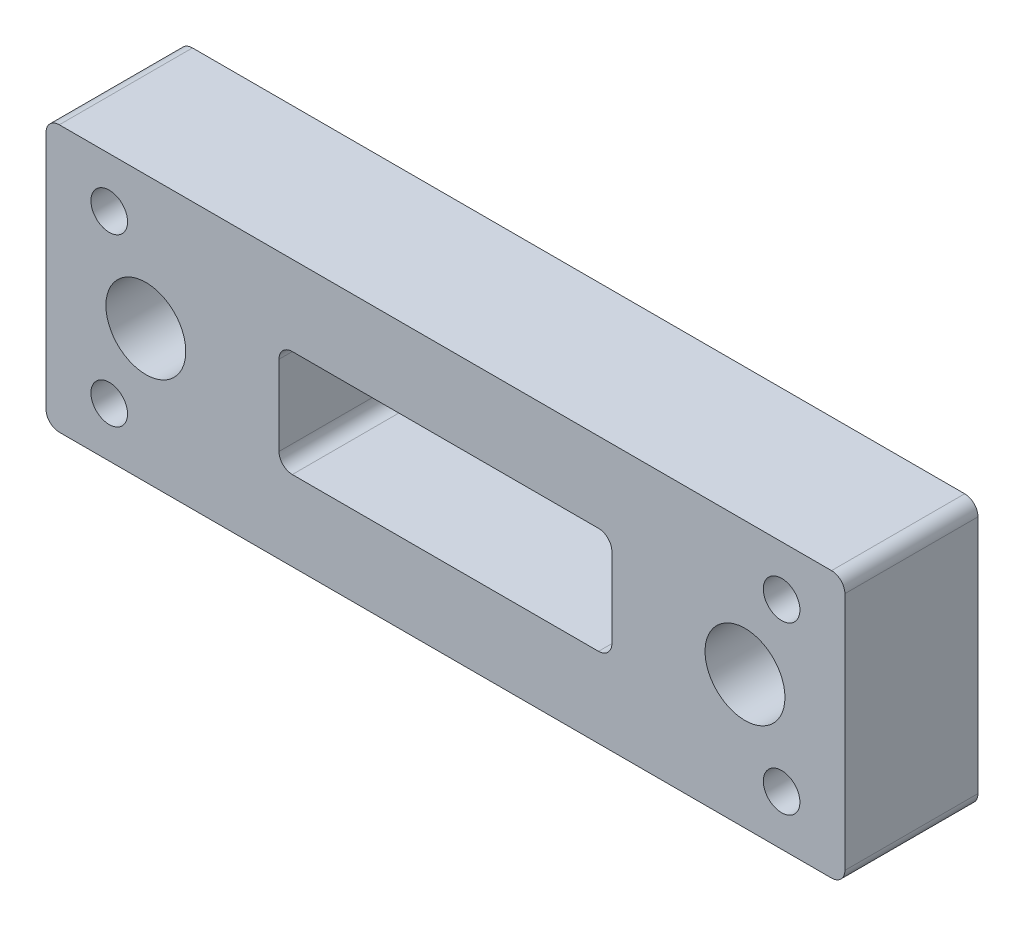
ISO-10303-21;
HEADER;
FILE_DESCRIPTION(('STEP AP214'),'2;1');
FILE_NAME('part.step','',(''),(''),'','','');
FILE_SCHEMA(('AUTOMOTIVE_DESIGN { 1 0 10303 214 1 1 1 1 }'));
ENDSEC;
DATA;
#1=APPLICATION_CONTEXT('core data for automotive mechanical design processes');
#2=APPLICATION_PROTOCOL_DEFINITION('international standard','automotive_design',2000,#1);
#3=PRODUCT_CONTEXT('',#1,'mechanical');
#4=PRODUCT('Part','Part','',(#3));
#5=PRODUCT_RELATED_PRODUCT_CATEGORY('part','',(#4));
#6=PRODUCT_DEFINITION_FORMATION('','',#4);
#7=PRODUCT_DEFINITION_CONTEXT('part definition',#1,'design');
#8=PRODUCT_DEFINITION('design','',#6,#7);
#9=PRODUCT_DEFINITION_SHAPE('','',#8);
#10=(LENGTH_UNIT() NAMED_UNIT(*) SI_UNIT(.MILLI.,.METRE.));
#11=(NAMED_UNIT(*) PLANE_ANGLE_UNIT() SI_UNIT($,.RADIAN.));
#12=(NAMED_UNIT(*) SI_UNIT($,.STERADIAN.) SOLID_ANGLE_UNIT());
#13=UNCERTAINTY_MEASURE_WITH_UNIT(LENGTH_MEASURE(1.E-05),#10,'distance_accuracy_value','');
#14=(GEOMETRIC_REPRESENTATION_CONTEXT(3) GLOBAL_UNCERTAINTY_ASSIGNED_CONTEXT((#13)) GLOBAL_UNIT_ASSIGNED_CONTEXT((#10,
#11,#12)) REPRESENTATION_CONTEXT('',''));
#15=CARTESIAN_POINT('',(0.,0.,0.));
#16=DIRECTION('',(0.,0.,1.));
#17=DIRECTION('',(1.,0.,0.));
#18=AXIS2_PLACEMENT_3D('',#15,#16,#17);
#19=CARTESIAN_POINT('',(-60.,20.,20.));
#20=DIRECTION('',(1.,0.,0.));
#21=DIRECTION('',(0.,1.,0.));
#22=AXIS2_PLACEMENT_3D('',#19,#20,#21);
#23=PLANE('',#22);
#24=DIRECTION('',(0.,-1.,0.));
#25=VECTOR('',#24,1.);
#26=CARTESIAN_POINT('',(-60.,20.,20.));
#27=LINE('',#26,#25);
#28=CARTESIAN_POINT('',(-60.,18.,20.));
#29=VERTEX_POINT('',#28);
#30=CARTESIAN_POINT('',(-60.,-18.,20.));
#31=VERTEX_POINT('',#30);
#32=EDGE_CURVE('E167',#29,#31,#27,.T.);
#33=ORIENTED_EDGE('',*,*,#32,.F.);
#34=DIRECTION('',(0.,0.,-1.));
#35=VECTOR('',#34,1.);
#36=CARTESIAN_POINT('',(-60.,18.,20.));
#37=LINE('',#36,#35);
#38=CARTESIAN_POINT('',(-60.,18.,0.));
#39=VERTEX_POINT('',#38);
#40=EDGE_CURVE('E152',#29,#39,#37,.T.);
#41=ORIENTED_EDGE('',*,*,#40,.T.);
#42=DIRECTION('',(0.,-1.,0.));
#43=VECTOR('',#42,1.);
#44=CARTESIAN_POINT('',(-60.,20.,0.));
#45=LINE('',#44,#43);
#46=CARTESIAN_POINT('',(-60.,-18.,0.));
#47=VERTEX_POINT('',#46);
#48=EDGE_CURVE('E164',#39,#47,#45,.T.);
#49=ORIENTED_EDGE('',*,*,#48,.T.);
#50=DIRECTION('',(0.,0.,-1.));
#51=VECTOR('',#50,1.);
#52=CARTESIAN_POINT('',(-60.,-18.,20.));
#53=LINE('',#52,#51);
#54=EDGE_CURVE('E169',#47,#31,#53,.F.);
#55=ORIENTED_EDGE('',*,*,#54,.T.);
#56=EDGE_LOOP('',(#33,#41,#49,#55));
#57=FACE_BOUND('',#56,.T.);
#58=ADVANCED_FACE('F35',(#57),#23,.F.);
#59=CARTESIAN_POINT('',(-60.,-20.,20.));
#60=DIRECTION('',(0.,1.,0.));
#61=DIRECTION('',(-1.,0.,0.));
#62=AXIS2_PLACEMENT_3D('',#59,#60,#61);
#63=PLANE('',#62);
#64=DIRECTION('',(1.,0.,0.));
#65=VECTOR('',#64,1.);
#66=CARTESIAN_POINT('',(-60.,-20.,20.));
#67=LINE('',#66,#65);
#68=CARTESIAN_POINT('',(-58.,-20.,20.));
#69=VERTEX_POINT('',#68);
#70=CARTESIAN_POINT('',(58.,-20.,20.));
#71=VERTEX_POINT('',#70);
#72=EDGE_CURVE('E313',#69,#71,#67,.T.);
#73=ORIENTED_EDGE('',*,*,#72,.F.);
#74=DIRECTION('',(0.,0.,-1.));
#75=VECTOR('',#74,1.);
#76=CARTESIAN_POINT('',(-58.,-20.,20.));
#77=LINE('',#76,#75);
#78=CARTESIAN_POINT('',(-58.,-20.,0.));
#79=VERTEX_POINT('',#78);
#80=EDGE_CURVE('E208',#69,#79,#77,.T.);
#81=ORIENTED_EDGE('',*,*,#80,.T.);
#82=DIRECTION('',(1.,0.,0.));
#83=VECTOR('',#82,1.);
#84=CARTESIAN_POINT('',(-60.,-20.,0.));
#85=LINE('',#84,#83);
#86=CARTESIAN_POINT('',(58.,-20.,0.));
#87=VERTEX_POINT('',#86);
#88=EDGE_CURVE('E173',#79,#87,#85,.T.);
#89=ORIENTED_EDGE('',*,*,#88,.T.);
#90=DIRECTION('',(0.,0.,-1.));
#91=VECTOR('',#90,1.);
#92=CARTESIAN_POINT('',(58.,-20.,20.));
#93=LINE('',#92,#91);
#94=EDGE_CURVE('E206',#87,#71,#93,.F.);
#95=ORIENTED_EDGE('',*,*,#94,.T.);
#96=EDGE_LOOP('',(#73,#81,#89,#95));
#97=FACE_BOUND('',#96,.T.);
#98=ADVANCED_FACE('F338',(#97),#63,.F.);
#99=CARTESIAN_POINT('',(60.,20.,20.));
#100=DIRECTION('',(-1.,0.,0.));
#101=DIRECTION('',(0.,-1.,0.));
#102=AXIS2_PLACEMENT_3D('',#99,#100,#101);
#103=PLANE('',#102);
#104=DIRECTION('',(0.,1.,0.));
#105=VECTOR('',#104,1.);
#106=CARTESIAN_POINT('',(60.,20.,0.));
#107=LINE('',#106,#105);
#108=CARTESIAN_POINT('',(60.,-18.,0.));
#109=VERTEX_POINT('',#108);
#110=CARTESIAN_POINT('',(60.,18.,0.));
#111=VERTEX_POINT('',#110);
#112=EDGE_CURVE('E177',#109,#111,#107,.T.);
#113=ORIENTED_EDGE('',*,*,#112,.T.);
#114=DIRECTION('',(0.,0.,-1.));
#115=VECTOR('',#114,1.);
#116=CARTESIAN_POINT('',(60.,18.,20.));
#117=LINE('',#116,#115);
#118=CARTESIAN_POINT('',(60.,18.,20.));
#119=VERTEX_POINT('',#118);
#120=EDGE_CURVE('E214',#111,#119,#117,.F.);
#121=ORIENTED_EDGE('',*,*,#120,.T.);
#122=DIRECTION('',(0.,1.,0.));
#123=VECTOR('',#122,1.);
#124=CARTESIAN_POINT('',(60.,20.,20.));
#125=LINE('',#124,#123);
#126=CARTESIAN_POINT('',(60.,-18.,20.));
#127=VERTEX_POINT('',#126);
#128=EDGE_CURVE('E315',#127,#119,#125,.T.);
#129=ORIENTED_EDGE('',*,*,#128,.F.);
#130=DIRECTION('',(0.,0.,-1.));
#131=VECTOR('',#130,1.);
#132=CARTESIAN_POINT('',(60.,-18.,20.));
#133=LINE('',#132,#131);
#134=EDGE_CURVE('E211',#127,#109,#133,.T.);
#135=ORIENTED_EDGE('',*,*,#134,.T.);
#136=EDGE_LOOP('',(#113,#121,#129,#135));
#137=FACE_BOUND('',#136,.T.);
#138=ADVANCED_FACE('F330',(#137),#103,.F.);
#139=CARTESIAN_POINT('',(-60.,20.,20.));
#140=DIRECTION('',(0.,-1.,0.));
#141=DIRECTION('',(0.,0.,-1.));
#142=AXIS2_PLACEMENT_3D('',#139,#140,#141);
#143=PLANE('',#142);
#144=DIRECTION('',(-1.,0.,0.));
#145=VECTOR('',#144,1.);
#146=CARTESIAN_POINT('',(-60.,20.,0.));
#147=LINE('',#146,#145);
#148=CARTESIAN_POINT('',(58.,20.,0.));
#149=VERTEX_POINT('',#148);
#150=CARTESIAN_POINT('',(-58.,20.,0.));
#151=VERTEX_POINT('',#150);
#152=EDGE_CURVE('E188',#149,#151,#147,.T.);
#153=ORIENTED_EDGE('',*,*,#152,.T.);
#154=DIRECTION('',(0.,0.,-1.));
#155=VECTOR('',#154,1.);
#156=CARTESIAN_POINT('',(-58.,20.,20.));
#157=LINE('',#156,#155);
#158=CARTESIAN_POINT('',(-58.,20.,20.));
#159=VERTEX_POINT('',#158);
#160=EDGE_CURVE('E153',#151,#159,#157,.F.);
#161=ORIENTED_EDGE('',*,*,#160,.T.);
#162=DIRECTION('',(-1.,0.,0.));
#163=VECTOR('',#162,1.);
#164=CARTESIAN_POINT('',(-60.,20.,20.));
#165=LINE('',#164,#163);
#166=CARTESIAN_POINT('',(58.,20.,20.));
#167=VERTEX_POINT('',#166);
#168=EDGE_CURVE('E183',#167,#159,#165,.T.);
#169=ORIENTED_EDGE('',*,*,#168,.F.);
#170=DIRECTION('',(0.,0.,-1.));
#171=VECTOR('',#170,1.);
#172=CARTESIAN_POINT('',(58.,20.,20.));
#173=LINE('',#172,#171);
#174=EDGE_CURVE('E158',#167,#149,#173,.T.);
#175=ORIENTED_EDGE('',*,*,#174,.T.);
#176=EDGE_LOOP('',(#153,#161,#169,#175));
#177=FACE_BOUND('',#176,.T.);
#178=ADVANCED_FACE('F324',(#177),#143,.F.);
#179=CARTESIAN_POINT('',(0.,0.,20.));
#180=DIRECTION('',(0.,0.,1.));
#181=DIRECTION('',(1.,0.,0.));
#182=AXIS2_PLACEMENT_3D('',#179,#180,#181);
#183=PLANE('',#182);
#184=DIRECTION('',(0.,-1.,0.));
#185=VECTOR('',#184,1.);
#186=CARTESIAN_POINT('',(-25.,8.,20.));
#187=LINE('',#186,#185);
#188=CARTESIAN_POINT('',(-25.,6.,20.));
#189=VERTEX_POINT('',#188);
#190=CARTESIAN_POINT('',(-25.,-6.,20.));
#191=VERTEX_POINT('',#190);
#192=EDGE_CURVE('E277',#189,#191,#187,.T.);
#193=ORIENTED_EDGE('',*,*,#192,.F.);
#194=CARTESIAN_POINT('',(-23.,6.,20.));
#195=DIRECTION('',(0.,0.,1.));
#196=DIRECTION('',(1.,0.,0.));
#197=AXIS2_PLACEMENT_3D('',#194,#195,#196);
#198=CIRCLE('',#197,2.);
#199=CARTESIAN_POINT('',(-23.,8.,20.));
#200=VERTEX_POINT('',#199);
#201=EDGE_CURVE('E243',#189,#200,#198,.F.);
#202=ORIENTED_EDGE('',*,*,#201,.T.);
#203=DIRECTION('',(-1.,0.,0.));
#204=VECTOR('',#203,1.);
#205=CARTESIAN_POINT('',(-25.,8.,20.));
#206=LINE('',#205,#204);
#207=CARTESIAN_POINT('',(23.,8.,20.));
#208=VERTEX_POINT('',#207);
#209=EDGE_CURVE('E254',#208,#200,#206,.T.);
#210=ORIENTED_EDGE('',*,*,#209,.F.);
#211=CARTESIAN_POINT('',(23.,6.,20.));
#212=DIRECTION('',(0.,0.,1.));
#213=DIRECTION('',(1.,0.,0.));
#214=AXIS2_PLACEMENT_3D('',#211,#212,#213);
#215=CIRCLE('',#214,2.);
#216=CARTESIAN_POINT('',(25.,6.,20.));
#217=VERTEX_POINT('',#216);
#218=EDGE_CURVE('E43',#208,#217,#215,.F.);
#219=ORIENTED_EDGE('',*,*,#218,.T.);
#220=DIRECTION('',(0.,1.,0.));
#221=VECTOR('',#220,1.);
#222=CARTESIAN_POINT('',(25.,8.,20.));
#223=LINE('',#222,#221);
#224=CARTESIAN_POINT('',(25.,-5.99999999999999,20.));
#225=VERTEX_POINT('',#224);
#226=EDGE_CURVE('E253',#225,#217,#223,.T.);
#227=ORIENTED_EDGE('',*,*,#226,.F.);
#228=CARTESIAN_POINT('',(23.,-6.,20.));
#229=DIRECTION('',(0.,0.,1.));
#230=DIRECTION('',(1.,0.,0.));
#231=AXIS2_PLACEMENT_3D('',#228,#229,#230);
#232=CIRCLE('',#231,2.);
#233=CARTESIAN_POINT('',(23.,-8.,20.));
#234=VERTEX_POINT('',#233);
#235=EDGE_CURVE('E235',#225,#234,#232,.F.);
#236=ORIENTED_EDGE('',*,*,#235,.T.);
#237=DIRECTION('',(1.,0.,0.));
#238=VECTOR('',#237,1.);
#239=CARTESIAN_POINT('',(-25.,-8.,20.));
#240=LINE('',#239,#238);
#241=CARTESIAN_POINT('',(-23.,-8.,20.));
#242=VERTEX_POINT('',#241);
#243=EDGE_CURVE('E262',#242,#234,#240,.T.);
#244=ORIENTED_EDGE('',*,*,#243,.F.);
#245=CARTESIAN_POINT('',(-23.,-6.,20.));
#246=DIRECTION('',(0.,0.,1.));
#247=DIRECTION('',(1.,0.,0.));
#248=AXIS2_PLACEMENT_3D('',#245,#246,#247);
#249=CIRCLE('',#248,2.);
#250=EDGE_CURVE('E239',#242,#191,#249,.F.);
#251=ORIENTED_EDGE('',*,*,#250,.T.);
#252=EDGE_LOOP('',(#193,#202,#210,#219,#227,#236,#244,#251));
#253=FACE_BOUND('',#252,.T.);
#254=CARTESIAN_POINT('',(50.5,12.5,20.));
#255=DIRECTION('',(0.,0.,1.));
#256=DIRECTION('',(1.,0.,0.));
#257=AXIS2_PLACEMENT_3D('',#254,#255,#256);
#258=CIRCLE('',#257,2.75);
#259=CARTESIAN_POINT('',(53.25,12.5,20.));
#260=VERTEX_POINT('',#259);
#261=EDGE_CURVE('E290',#260,#260,#258,.T.);
#262=ORIENTED_EDGE('',*,*,#261,.F.);
#263=EDGE_LOOP('',(#262));
#264=FACE_BOUND('',#263,.T.);
#265=CARTESIAN_POINT('',(50.5,-12.5,20.));
#266=DIRECTION('',(0.,0.,1.));
#267=DIRECTION('',(-1.,0.,0.));
#268=AXIS2_PLACEMENT_3D('',#265,#266,#267);
#269=CIRCLE('',#268,2.75);
#270=CARTESIAN_POINT('',(47.75,-12.5,20.));
#271=VERTEX_POINT('',#270);
#272=EDGE_CURVE('E296',#271,#271,#269,.T.);
#273=ORIENTED_EDGE('',*,*,#272,.F.);
#274=EDGE_LOOP('',(#273));
#275=FACE_BOUND('',#274,.T.);
#276=CARTESIAN_POINT('',(-50.5,-12.5,20.));
#277=DIRECTION('',(0.,0.,1.));
#278=DIRECTION('',(1.,0.,0.));
#279=AXIS2_PLACEMENT_3D('',#276,#277,#278);
#280=CIRCLE('',#279,2.75);
#281=CARTESIAN_POINT('',(-47.75,-12.5,20.));
#282=VERTEX_POINT('',#281);
#283=EDGE_CURVE('E302',#282,#282,#280,.T.);
#284=ORIENTED_EDGE('',*,*,#283,.F.);
#285=EDGE_LOOP('',(#284));
#286=FACE_BOUND('',#285,.T.);
#287=CARTESIAN_POINT('',(-50.5,12.5,20.));
#288=DIRECTION('',(0.,0.,1.));
#289=DIRECTION('',(-1.,0.,0.));
#290=AXIS2_PLACEMENT_3D('',#287,#288,#289);
#291=CIRCLE('',#290,2.75);
#292=CARTESIAN_POINT('',(-53.25,12.5,20.));
#293=VERTEX_POINT('',#292);
#294=EDGE_CURVE('E285',#293,#293,#291,.T.);
#295=ORIENTED_EDGE('',*,*,#294,.F.);
#296=EDGE_LOOP('',(#295));
#297=FACE_BOUND('',#296,.T.);
#298=CARTESIAN_POINT('',(-45.,0.,20.));
#299=DIRECTION('',(0.,0.,1.));
#300=DIRECTION('',(-1.,0.,0.));
#301=AXIS2_PLACEMENT_3D('',#298,#299,#300);
#302=CIRCLE('',#301,6.);
#303=CARTESIAN_POINT('',(-51.,0.,20.));
#304=VERTEX_POINT('',#303);
#305=EDGE_CURVE('E267',#304,#304,#302,.T.);
#306=ORIENTED_EDGE('',*,*,#305,.F.);
#307=EDGE_LOOP('',(#306));
#308=FACE_BOUND('',#307,.T.);
#309=CARTESIAN_POINT('',(45.,0.,20.));
#310=DIRECTION('',(0.,0.,1.));
#311=DIRECTION('',(1.,0.,0.));
#312=AXIS2_PLACEMENT_3D('',#309,#310,#311);
#313=CIRCLE('',#312,6.);
#314=CARTESIAN_POINT('',(51.,0.,20.));
#315=VERTEX_POINT('',#314);
#316=EDGE_CURVE('E180',#315,#315,#313,.T.);
#317=ORIENTED_EDGE('',*,*,#316,.F.);
#318=EDGE_LOOP('',(#317));
#319=FACE_BOUND('',#318,.T.);
#320=ORIENTED_EDGE('',*,*,#168,.T.);
#321=CARTESIAN_POINT('',(-58.,18.,20.));
#322=DIRECTION('',(0.,0.,1.));
#323=DIRECTION('',(1.,0.,0.));
#324=AXIS2_PLACEMENT_3D('',#321,#322,#323);
#325=CIRCLE('',#324,2.);
#326=EDGE_CURVE('E204',#159,#29,#325,.T.);
#327=ORIENTED_EDGE('',*,*,#326,.T.);
#328=ORIENTED_EDGE('',*,*,#32,.T.);
#329=CARTESIAN_POINT('',(-58.,-18.,20.));
#330=DIRECTION('',(0.,0.,1.));
#331=DIRECTION('',(1.,0.,0.));
#332=AXIS2_PLACEMENT_3D('',#329,#330,#331);
#333=CIRCLE('',#332,2.);
#334=EDGE_CURVE('E202',#31,#69,#333,.T.);
#335=ORIENTED_EDGE('',*,*,#334,.T.);
#336=ORIENTED_EDGE('',*,*,#72,.T.);
#337=CARTESIAN_POINT('',(58.,-18.,20.));
#338=DIRECTION('',(0.,0.,1.));
#339=DIRECTION('',(1.,0.,0.));
#340=AXIS2_PLACEMENT_3D('',#337,#338,#339);
#341=CIRCLE('',#340,2.);
#342=EDGE_CURVE('E198',#71,#127,#341,.T.);
#343=ORIENTED_EDGE('',*,*,#342,.T.);
#344=ORIENTED_EDGE('',*,*,#128,.T.);
#345=CARTESIAN_POINT('',(58.,18.,20.));
#346=DIRECTION('',(0.,0.,1.));
#347=DIRECTION('',(1.,0.,0.));
#348=AXIS2_PLACEMENT_3D('',#345,#346,#347);
#349=CIRCLE('',#348,2.);
#350=EDGE_CURVE('E200',#119,#167,#349,.T.);
#351=ORIENTED_EDGE('',*,*,#350,.T.);
#352=EDGE_LOOP('',(#320,#327,#328,#335,#336,#343,#344,#351));
#353=FACE_BOUND('',#352,.T.);
#354=ADVANCED_FACE('F251',(#253,#264,#275,#286,#297,#308,#319,#353),#183,.T.);
#355=CARTESIAN_POINT('',(0.,0.,0.));
#356=DIRECTION('',(0.,0.,1.));
#357=DIRECTION('',(1.,0.,0.));
#358=AXIS2_PLACEMENT_3D('',#355,#356,#357);
#359=PLANE('',#358);
#360=DIRECTION('',(0.,1.,0.));
#361=VECTOR('',#360,1.);
#362=CARTESIAN_POINT('',(25.,8.,0.));
#363=LINE('',#362,#361);
#364=CARTESIAN_POINT('',(25.,-5.99999999999999,0.));
#365=VERTEX_POINT('',#364);
#366=CARTESIAN_POINT('',(25.,6.,0.));
#367=VERTEX_POINT('',#366);
#368=EDGE_CURVE('E268',#365,#367,#363,.T.);
#369=ORIENTED_EDGE('',*,*,#368,.T.);
#370=CARTESIAN_POINT('',(23.,6.,0.));
#371=DIRECTION('',(0.,0.,1.));
#372=DIRECTION('',(1.,0.,0.));
#373=AXIS2_PLACEMENT_3D('',#370,#371,#372);
#374=CIRCLE('',#373,2.);
#375=CARTESIAN_POINT('',(23.,8.,0.));
#376=VERTEX_POINT('',#375);
#377=EDGE_CURVE('E11',#367,#376,#374,.T.);
#378=ORIENTED_EDGE('',*,*,#377,.T.);
#379=DIRECTION('',(-1.,0.,0.));
#380=VECTOR('',#379,1.);
#381=CARTESIAN_POINT('',(-25.,8.,0.));
#382=LINE('',#381,#380);
#383=CARTESIAN_POINT('',(-23.,8.,0.));
#384=VERTEX_POINT('',#383);
#385=EDGE_CURVE('E265',#376,#384,#382,.T.);
#386=ORIENTED_EDGE('',*,*,#385,.T.);
#387=CARTESIAN_POINT('',(-23.,6.,0.));
#388=DIRECTION('',(0.,0.,1.));
#389=DIRECTION('',(1.,0.,0.));
#390=AXIS2_PLACEMENT_3D('',#387,#388,#389);
#391=CIRCLE('',#390,2.);
#392=CARTESIAN_POINT('',(-25.,6.,0.));
#393=VERTEX_POINT('',#392);
#394=EDGE_CURVE('E245',#384,#393,#391,.T.);
#395=ORIENTED_EDGE('',*,*,#394,.T.);
#396=DIRECTION('',(0.,-1.,0.));
#397=VECTOR('',#396,1.);
#398=CARTESIAN_POINT('',(-25.,8.,0.));
#399=LINE('',#398,#397);
#400=CARTESIAN_POINT('',(-25.,-6.,0.));
#401=VERTEX_POINT('',#400);
#402=EDGE_CURVE('E283',#393,#401,#399,.T.);
#403=ORIENTED_EDGE('',*,*,#402,.T.);
#404=CARTESIAN_POINT('',(-23.,-6.,0.));
#405=DIRECTION('',(0.,0.,1.));
#406=DIRECTION('',(1.,0.,0.));
#407=AXIS2_PLACEMENT_3D('',#404,#405,#406);
#408=CIRCLE('',#407,2.);
#409=CARTESIAN_POINT('',(-23.,-8.,0.));
#410=VERTEX_POINT('',#409);
#411=EDGE_CURVE('E241',#401,#410,#408,.T.);
#412=ORIENTED_EDGE('',*,*,#411,.T.);
#413=DIRECTION('',(1.,0.,0.));
#414=VECTOR('',#413,1.);
#415=CARTESIAN_POINT('',(-25.,-8.,0.));
#416=LINE('',#415,#414);
#417=CARTESIAN_POINT('',(23.,-8.,0.));
#418=VERTEX_POINT('',#417);
#419=EDGE_CURVE('E273',#410,#418,#416,.T.);
#420=ORIENTED_EDGE('',*,*,#419,.T.);
#421=CARTESIAN_POINT('',(23.,-6.,0.));
#422=DIRECTION('',(0.,0.,1.));
#423=DIRECTION('',(1.,0.,0.));
#424=AXIS2_PLACEMENT_3D('',#421,#422,#423);
#425=CIRCLE('',#424,2.);
#426=EDGE_CURVE('E237',#418,#365,#425,.T.);
#427=ORIENTED_EDGE('',*,*,#426,.T.);
#428=EDGE_LOOP('',(#369,#378,#386,#395,#403,#412,#420,#427));
#429=FACE_BOUND('',#428,.T.);
#430=CARTESIAN_POINT('',(50.5,12.5,0.));
#431=DIRECTION('',(0.,0.,1.));
#432=DIRECTION('',(1.,0.,0.));
#433=AXIS2_PLACEMENT_3D('',#430,#431,#432);
#434=CIRCLE('',#433,2.75);
#435=CARTESIAN_POINT('',(53.25,12.5,0.));
#436=VERTEX_POINT('',#435);
#437=EDGE_CURVE('E287',#436,#436,#434,.T.);
#438=ORIENTED_EDGE('',*,*,#437,.T.);
#439=EDGE_LOOP('',(#438));
#440=FACE_BOUND('',#439,.T.);
#441=CARTESIAN_POINT('',(50.5,-12.5,0.));
#442=DIRECTION('',(0.,0.,1.));
#443=DIRECTION('',(-1.,0.,0.));
#444=AXIS2_PLACEMENT_3D('',#441,#442,#443);
#445=CIRCLE('',#444,2.75);
#446=CARTESIAN_POINT('',(47.75,-12.5,0.));
#447=VERTEX_POINT('',#446);
#448=EDGE_CURVE('E293',#447,#447,#445,.T.);
#449=ORIENTED_EDGE('',*,*,#448,.T.);
#450=EDGE_LOOP('',(#449));
#451=FACE_BOUND('',#450,.T.);
#452=CARTESIAN_POINT('',(-50.5,-12.5,0.));
#453=DIRECTION('',(0.,0.,1.));
#454=DIRECTION('',(1.,0.,0.));
#455=AXIS2_PLACEMENT_3D('',#452,#453,#454);
#456=CIRCLE('',#455,2.75);
#457=CARTESIAN_POINT('',(-47.75,-12.5,0.));
#458=VERTEX_POINT('',#457);
#459=EDGE_CURVE('E299',#458,#458,#456,.T.);
#460=ORIENTED_EDGE('',*,*,#459,.T.);
#461=EDGE_LOOP('',(#460));
#462=FACE_BOUND('',#461,.T.);
#463=CARTESIAN_POINT('',(-50.5,12.5,0.));
#464=DIRECTION('',(0.,0.,1.));
#465=DIRECTION('',(-1.,0.,0.));
#466=AXIS2_PLACEMENT_3D('',#463,#464,#465);
#467=CIRCLE('',#466,2.75);
#468=CARTESIAN_POINT('',(-53.25,12.5,0.));
#469=VERTEX_POINT('',#468);
#470=EDGE_CURVE('E305',#469,#469,#467,.T.);
#471=ORIENTED_EDGE('',*,*,#470,.T.);
#472=EDGE_LOOP('',(#471));
#473=FACE_BOUND('',#472,.T.);
#474=CARTESIAN_POINT('',(-45.,0.,0.));
#475=DIRECTION('',(0.,0.,1.));
#476=DIRECTION('',(-1.,0.,0.));
#477=AXIS2_PLACEMENT_3D('',#474,#475,#476);
#478=CIRCLE('',#477,6.);
#479=CARTESIAN_POINT('',(-51.,0.,0.));
#480=VERTEX_POINT('',#479);
#481=EDGE_CURVE('E271',#480,#480,#478,.T.);
#482=ORIENTED_EDGE('',*,*,#481,.T.);
#483=EDGE_LOOP('',(#482));
#484=FACE_BOUND('',#483,.T.);
#485=CARTESIAN_POINT('',(45.,0.,0.));
#486=DIRECTION('',(0.,0.,1.));
#487=DIRECTION('',(1.,0.,0.));
#488=AXIS2_PLACEMENT_3D('',#485,#486,#487);
#489=CIRCLE('',#488,6.);
#490=CARTESIAN_POINT('',(51.,0.,0.));
#491=VERTEX_POINT('',#490);
#492=EDGE_CURVE('E174',#491,#491,#489,.T.);
#493=ORIENTED_EDGE('',*,*,#492,.T.);
#494=EDGE_LOOP('',(#493));
#495=FACE_BOUND('',#494,.T.);
#496=ORIENTED_EDGE('',*,*,#48,.F.);
#497=CARTESIAN_POINT('',(-58.,18.,0.));
#498=DIRECTION('',(0.,0.,1.));
#499=DIRECTION('',(1.,0.,0.));
#500=AXIS2_PLACEMENT_3D('',#497,#498,#499);
#501=CIRCLE('',#500,2.);
#502=EDGE_CURVE('E148',#39,#151,#501,.F.);
#503=ORIENTED_EDGE('',*,*,#502,.T.);
#504=ORIENTED_EDGE('',*,*,#152,.F.);
#505=CARTESIAN_POINT('',(58.,18.,0.));
#506=DIRECTION('',(0.,0.,1.));
#507=DIRECTION('',(1.,0.,0.));
#508=AXIS2_PLACEMENT_3D('',#505,#506,#507);
#509=CIRCLE('',#508,2.);
#510=EDGE_CURVE('E192',#149,#111,#509,.F.);
#511=ORIENTED_EDGE('',*,*,#510,.T.);
#512=ORIENTED_EDGE('',*,*,#112,.F.);
#513=CARTESIAN_POINT('',(58.,-18.,0.));
#514=DIRECTION('',(0.,0.,1.));
#515=DIRECTION('',(1.,0.,0.));
#516=AXIS2_PLACEMENT_3D('',#513,#514,#515);
#517=CIRCLE('',#516,2.);
#518=EDGE_CURVE('E168',#109,#87,#517,.F.);
#519=ORIENTED_EDGE('',*,*,#518,.T.);
#520=ORIENTED_EDGE('',*,*,#88,.F.);
#521=CARTESIAN_POINT('',(-58.,-18.,0.));
#522=DIRECTION('',(0.,0.,1.));
#523=DIRECTION('',(1.,0.,0.));
#524=AXIS2_PLACEMENT_3D('',#521,#522,#523);
#525=CIRCLE('',#524,2.);
#526=EDGE_CURVE('E159',#79,#47,#525,.F.);
#527=ORIENTED_EDGE('',*,*,#526,.T.);
#528=EDGE_LOOP('',(#496,#503,#504,#511,#512,#519,#520,#527));
#529=FACE_BOUND('',#528,.T.);
#530=ADVANCED_FACE('F171',(#429,#440,#451,#462,#473,#484,#495,#529),#359,.F.);
#531=CARTESIAN_POINT('',(45.,0.,0.));
#532=DIRECTION('',(0.,0.,1.));
#533=DIRECTION('',(1.,0.,0.));
#534=AXIS2_PLACEMENT_3D('',#531,#532,#533);
#535=CYLINDRICAL_SURFACE('',#534,6.);
#536=ORIENTED_EDGE('',*,*,#492,.F.);
#537=EDGE_LOOP('',(#536));
#538=FACE_BOUND('',#537,.T.);
#539=ORIENTED_EDGE('',*,*,#316,.T.);
#540=EDGE_LOOP('',(#539));
#541=FACE_BOUND('',#540,.T.);
#542=ADVANCED_FACE('F365',(#538,#541),#535,.F.);
#543=CARTESIAN_POINT('',(-45.,0.,0.));
#544=DIRECTION('',(0.,0.,1.));
#545=DIRECTION('',(1.,0.,0.));
#546=AXIS2_PLACEMENT_3D('',#543,#544,#545);
#547=CYLINDRICAL_SURFACE('',#546,6.);
#548=ORIENTED_EDGE('',*,*,#481,.F.);
#549=EDGE_LOOP('',(#548));
#550=FACE_BOUND('',#549,.T.);
#551=ORIENTED_EDGE('',*,*,#305,.T.);
#552=EDGE_LOOP('',(#551));
#553=FACE_BOUND('',#552,.T.);
#554=ADVANCED_FACE('F370',(#550,#553),#547,.F.);
#555=CARTESIAN_POINT('',(-50.5,12.5,0.));
#556=DIRECTION('',(0.,0.,1.));
#557=DIRECTION('',(1.,0.,0.));
#558=AXIS2_PLACEMENT_3D('',#555,#556,#557);
#559=CYLINDRICAL_SURFACE('',#558,2.75);
#560=ORIENTED_EDGE('',*,*,#470,.F.);
#561=EDGE_LOOP('',(#560));
#562=FACE_BOUND('',#561,.T.);
#563=ORIENTED_EDGE('',*,*,#294,.T.);
#564=EDGE_LOOP('',(#563));
#565=FACE_BOUND('',#564,.T.);
#566=ADVANCED_FACE('F372',(#562,#565),#559,.F.);
#567=CARTESIAN_POINT('',(-50.5,-12.5,0.));
#568=DIRECTION('',(0.,0.,1.));
#569=DIRECTION('',(1.,0.,0.));
#570=AXIS2_PLACEMENT_3D('',#567,#568,#569);
#571=CYLINDRICAL_SURFACE('',#570,2.75);
#572=ORIENTED_EDGE('',*,*,#459,.F.);
#573=EDGE_LOOP('',(#572));
#574=FACE_BOUND('',#573,.T.);
#575=ORIENTED_EDGE('',*,*,#283,.T.);
#576=EDGE_LOOP('',(#575));
#577=FACE_BOUND('',#576,.T.);
#578=ADVANCED_FACE('F375',(#574,#577),#571,.F.);
#579=CARTESIAN_POINT('',(50.5,-12.5,0.));
#580=DIRECTION('',(0.,0.,1.));
#581=DIRECTION('',(1.,0.,0.));
#582=AXIS2_PLACEMENT_3D('',#579,#580,#581);
#583=CYLINDRICAL_SURFACE('',#582,2.75);
#584=ORIENTED_EDGE('',*,*,#448,.F.);
#585=EDGE_LOOP('',(#584));
#586=FACE_BOUND('',#585,.T.);
#587=ORIENTED_EDGE('',*,*,#272,.T.);
#588=EDGE_LOOP('',(#587));
#589=FACE_BOUND('',#588,.T.);
#590=ADVANCED_FACE('F379',(#586,#589),#583,.F.);
#591=CARTESIAN_POINT('',(50.5,12.5,0.));
#592=DIRECTION('',(0.,0.,1.));
#593=DIRECTION('',(1.,0.,0.));
#594=AXIS2_PLACEMENT_3D('',#591,#592,#593);
#595=CYLINDRICAL_SURFACE('',#594,2.75);
#596=ORIENTED_EDGE('',*,*,#437,.F.);
#597=EDGE_LOOP('',(#596));
#598=FACE_BOUND('',#597,.T.);
#599=ORIENTED_EDGE('',*,*,#261,.T.);
#600=EDGE_LOOP('',(#599));
#601=FACE_BOUND('',#600,.T.);
#602=ADVANCED_FACE('F350',(#598,#601),#595,.F.);
#603=CARTESIAN_POINT('',(-58.,18.,20.));
#604=DIRECTION('',(0.,0.,-1.));
#605=DIRECTION('',(-1.,0.,0.));
#606=AXIS2_PLACEMENT_3D('',#603,#604,#605);
#607=CYLINDRICAL_SURFACE('',#606,2.);
#608=ORIENTED_EDGE('',*,*,#326,.F.);
#609=ORIENTED_EDGE('',*,*,#160,.F.);
#610=ORIENTED_EDGE('',*,*,#502,.F.);
#611=ORIENTED_EDGE('',*,*,#40,.F.);
#612=EDGE_LOOP('',(#608,#609,#610,#611));
#613=FACE_BOUND('',#612,.T.);
#614=ADVANCED_FACE('F151',(#613),#607,.T.);
#615=CARTESIAN_POINT('',(-58.,-18.,20.));
#616=DIRECTION('',(0.,0.,-1.));
#617=DIRECTION('',(-1.,0.,0.));
#618=AXIS2_PLACEMENT_3D('',#615,#616,#617);
#619=CYLINDRICAL_SURFACE('',#618,2.);
#620=ORIENTED_EDGE('',*,*,#334,.F.);
#621=ORIENTED_EDGE('',*,*,#54,.F.);
#622=ORIENTED_EDGE('',*,*,#526,.F.);
#623=ORIENTED_EDGE('',*,*,#80,.F.);
#624=EDGE_LOOP('',(#620,#621,#622,#623));
#625=FACE_BOUND('',#624,.T.);
#626=ADVANCED_FACE('F342',(#625),#619,.T.);
#627=CARTESIAN_POINT('',(58.,18.,20.));
#628=DIRECTION('',(0.,0.,-1.));
#629=DIRECTION('',(-1.,0.,0.));
#630=AXIS2_PLACEMENT_3D('',#627,#628,#629);
#631=CYLINDRICAL_SURFACE('',#630,2.);
#632=ORIENTED_EDGE('',*,*,#350,.F.);
#633=ORIENTED_EDGE('',*,*,#120,.F.);
#634=ORIENTED_EDGE('',*,*,#510,.F.);
#635=ORIENTED_EDGE('',*,*,#174,.F.);
#636=EDGE_LOOP('',(#632,#633,#634,#635));
#637=FACE_BOUND('',#636,.T.);
#638=ADVANCED_FACE('F326',(#637),#631,.T.);
#639=CARTESIAN_POINT('',(58.,-18.,20.));
#640=DIRECTION('',(0.,0.,-1.));
#641=DIRECTION('',(-1.,0.,0.));
#642=AXIS2_PLACEMENT_3D('',#639,#640,#641);
#643=CYLINDRICAL_SURFACE('',#642,2.);
#644=ORIENTED_EDGE('',*,*,#342,.F.);
#645=ORIENTED_EDGE('',*,*,#94,.F.);
#646=ORIENTED_EDGE('',*,*,#518,.F.);
#647=ORIENTED_EDGE('',*,*,#134,.F.);
#648=EDGE_LOOP('',(#644,#645,#646,#647));
#649=FACE_BOUND('',#648,.T.);
#650=ADVANCED_FACE('F334',(#649),#643,.T.);
#651=CARTESIAN_POINT('',(-25.,8.,0.));
#652=DIRECTION('',(-1.,0.,0.));
#653=DIRECTION('',(0.,0.,1.));
#654=AXIS2_PLACEMENT_3D('',#651,#652,#653);
#655=PLANE('',#654);
#656=ORIENTED_EDGE('',*,*,#192,.T.);
#657=DIRECTION('',(0.,0.,1.));
#658=VECTOR('',#657,1.);
#659=CARTESIAN_POINT('',(-25.,-6.,0.));
#660=LINE('',#659,#658);
#661=EDGE_CURVE('E229',#191,#401,#660,.F.);
#662=ORIENTED_EDGE('',*,*,#661,.T.);
#663=ORIENTED_EDGE('',*,*,#402,.F.);
#664=DIRECTION('',(0.,0.,1.));
#665=VECTOR('',#664,1.);
#666=CARTESIAN_POINT('',(-25.,6.,20.));
#667=LINE('',#666,#665);
#668=EDGE_CURVE('E226',#393,#189,#667,.T.);
#669=ORIENTED_EDGE('',*,*,#668,.T.);
#670=EDGE_LOOP('',(#656,#662,#663,#669));
#671=FACE_BOUND('',#670,.T.);
#672=ADVANCED_FACE('F390',(#671),#655,.F.);
#673=CARTESIAN_POINT('',(-25.,8.,0.));
#674=DIRECTION('',(0.,1.,0.));
#675=DIRECTION('',(0.,0.,1.));
#676=AXIS2_PLACEMENT_3D('',#673,#674,#675);
#677=PLANE('',#676);
#678=ORIENTED_EDGE('',*,*,#209,.T.);
#679=DIRECTION('',(0.,0.,1.));
#680=VECTOR('',#679,1.);
#681=CARTESIAN_POINT('',(-23.,8.,0.));
#682=LINE('',#681,#680);
#683=EDGE_CURVE('E50',#200,#384,#682,.F.);
#684=ORIENTED_EDGE('',*,*,#683,.T.);
#685=ORIENTED_EDGE('',*,*,#385,.F.);
#686=DIRECTION('',(0.,0.,1.));
#687=VECTOR('',#686,1.);
#688=CARTESIAN_POINT('',(23.,8.,20.));
#689=LINE('',#688,#687);
#690=EDGE_CURVE('E231',#376,#208,#689,.T.);
#691=ORIENTED_EDGE('',*,*,#690,.T.);
#692=EDGE_LOOP('',(#678,#684,#685,#691));
#693=FACE_BOUND('',#692,.T.);
#694=ADVANCED_FACE('F264',(#693),#677,.F.);
#695=CARTESIAN_POINT('',(25.,8.,0.));
#696=DIRECTION('',(1.,0.,0.));
#697=DIRECTION('',(0.,1.,0.));
#698=AXIS2_PLACEMENT_3D('',#695,#696,#697);
#699=PLANE('',#698);
#700=ORIENTED_EDGE('',*,*,#368,.F.);
#701=DIRECTION('',(0.,0.,1.));
#702=VECTOR('',#701,1.);
#703=CARTESIAN_POINT('',(25.,-6.,20.));
#704=LINE('',#703,#702);
#705=EDGE_CURVE('E218',#365,#225,#704,.T.);
#706=ORIENTED_EDGE('',*,*,#705,.T.);
#707=ORIENTED_EDGE('',*,*,#226,.T.);
#708=DIRECTION('',(0.,0.,1.));
#709=VECTOR('',#708,1.);
#710=CARTESIAN_POINT('',(25.,6.,0.));
#711=LINE('',#710,#709);
#712=EDGE_CURVE('E216',#217,#367,#711,.F.);
#713=ORIENTED_EDGE('',*,*,#712,.T.);
#714=EDGE_LOOP('',(#700,#706,#707,#713));
#715=FACE_BOUND('',#714,.T.);
#716=ADVANCED_FACE('F260',(#715),#699,.F.);
#717=CARTESIAN_POINT('',(-25.,-8.,0.));
#718=DIRECTION('',(0.,-1.,0.));
#719=DIRECTION('',(0.,0.,-1.));
#720=AXIS2_PLACEMENT_3D('',#717,#718,#719);
#721=PLANE('',#720);
#722=ORIENTED_EDGE('',*,*,#243,.T.);
#723=DIRECTION('',(0.,0.,1.));
#724=VECTOR('',#723,1.);
#725=CARTESIAN_POINT('',(23.,-8.,0.));
#726=LINE('',#725,#724);
#727=EDGE_CURVE('E224',#234,#418,#726,.F.);
#728=ORIENTED_EDGE('',*,*,#727,.T.);
#729=ORIENTED_EDGE('',*,*,#419,.F.);
#730=DIRECTION('',(0.,0.,1.));
#731=VECTOR('',#730,1.);
#732=CARTESIAN_POINT('',(-23.,-8.,20.));
#733=LINE('',#732,#731);
#734=EDGE_CURVE('E221',#410,#242,#733,.T.);
#735=ORIENTED_EDGE('',*,*,#734,.T.);
#736=EDGE_LOOP('',(#722,#728,#729,#735));
#737=FACE_BOUND('',#736,.T.);
#738=ADVANCED_FACE('F394',(#737),#721,.F.);
#739=CARTESIAN_POINT('',(23.,-6.,0.));
#740=DIRECTION('',(0.,0.,-1.));
#741=DIRECTION('',(-1.,0.,0.));
#742=AXIS2_PLACEMENT_3D('',#739,#740,#741);
#743=CYLINDRICAL_SURFACE('',#742,2.);
#744=ORIENTED_EDGE('',*,*,#426,.F.);
#745=ORIENTED_EDGE('',*,*,#727,.F.);
#746=ORIENTED_EDGE('',*,*,#235,.F.);
#747=ORIENTED_EDGE('',*,*,#705,.F.);
#748=EDGE_LOOP('',(#744,#745,#746,#747));
#749=FACE_BOUND('',#748,.T.);
#750=ADVANCED_FACE('F397',(#749),#743,.F.);
#751=CARTESIAN_POINT('',(-23.,-6.,0.));
#752=DIRECTION('',(0.,0.,-1.));
#753=DIRECTION('',(-1.,0.,0.));
#754=AXIS2_PLACEMENT_3D('',#751,#752,#753);
#755=CYLINDRICAL_SURFACE('',#754,2.);
#756=ORIENTED_EDGE('',*,*,#411,.F.);
#757=ORIENTED_EDGE('',*,*,#661,.F.);
#758=ORIENTED_EDGE('',*,*,#250,.F.);
#759=ORIENTED_EDGE('',*,*,#734,.F.);
#760=EDGE_LOOP('',(#756,#757,#758,#759));
#761=FACE_BOUND('',#760,.T.);
#762=ADVANCED_FACE('F421',(#761),#755,.F.);
#763=CARTESIAN_POINT('',(-23.,6.,0.));
#764=DIRECTION('',(0.,0.,-1.));
#765=DIRECTION('',(-1.,0.,0.));
#766=AXIS2_PLACEMENT_3D('',#763,#764,#765);
#767=CYLINDRICAL_SURFACE('',#766,2.);
#768=ORIENTED_EDGE('',*,*,#394,.F.);
#769=ORIENTED_EDGE('',*,*,#683,.F.);
#770=ORIENTED_EDGE('',*,*,#201,.F.);
#771=ORIENTED_EDGE('',*,*,#668,.F.);
#772=EDGE_LOOP('',(#768,#769,#770,#771));
#773=FACE_BOUND('',#772,.T.);
#774=ADVANCED_FACE('F429',(#773),#767,.F.);
#775=CARTESIAN_POINT('',(23.,6.,0.));
#776=DIRECTION('',(0.,0.,-1.));
#777=DIRECTION('',(-1.,0.,0.));
#778=AXIS2_PLACEMENT_3D('',#775,#776,#777);
#779=CYLINDRICAL_SURFACE('',#778,2.);
#780=ORIENTED_EDGE('',*,*,#377,.F.);
#781=ORIENTED_EDGE('',*,*,#712,.F.);
#782=ORIENTED_EDGE('',*,*,#218,.F.);
#783=ORIENTED_EDGE('',*,*,#690,.F.);
#784=EDGE_LOOP('',(#780,#781,#782,#783));
#785=FACE_BOUND('',#784,.T.);
#786=ADVANCED_FACE('F37',(#785),#779,.F.);
#787=CLOSED_SHELL('',(#58,#98,#138,#178,#354,#530,#542,#554,#566,#578,#590,#602,#614,#626,#638,
#650,#672,#694,#716,#738,#750,#762,#774,#786));
#788=MANIFOLD_SOLID_BREP('B2',#787);
#789=ADVANCED_BREP_SHAPE_REPRESENTATION('',(#18,#788),#14);
#790=SHAPE_DEFINITION_REPRESENTATION(#9,#789);
ENDSEC;
END-ISO-10303-21;
